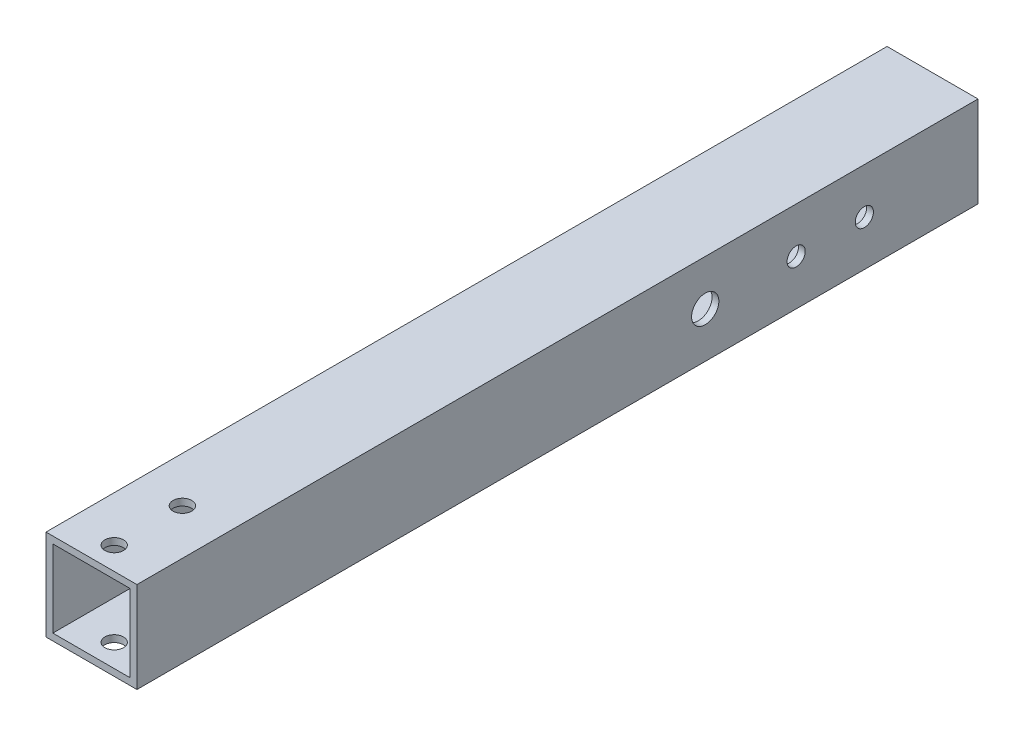
ISO-10303-21;
HEADER;
FILE_DESCRIPTION(('STEP AP214'),'2;1');
FILE_NAME('part.step','',(''),(''),'','','');
FILE_SCHEMA(('AUTOMOTIVE_DESIGN { 1 0 10303 214 1 1 1 1 }'));
ENDSEC;
DATA;
#1=APPLICATION_CONTEXT('core data for automotive mechanical design processes');
#2=APPLICATION_PROTOCOL_DEFINITION('international standard','automotive_design',2000,#1);
#3=PRODUCT_CONTEXT('',#1,'mechanical');
#4=PRODUCT('Part','Part','',(#3));
#5=PRODUCT_RELATED_PRODUCT_CATEGORY('part','',(#4));
#6=PRODUCT_DEFINITION_FORMATION('','',#4);
#7=PRODUCT_DEFINITION_CONTEXT('part definition',#1,'design');
#8=PRODUCT_DEFINITION('design','',#6,#7);
#9=PRODUCT_DEFINITION_SHAPE('','',#8);
#10=(LENGTH_UNIT() NAMED_UNIT(*) SI_UNIT(.MILLI.,.METRE.));
#11=(NAMED_UNIT(*) PLANE_ANGLE_UNIT() SI_UNIT($,.RADIAN.));
#12=(NAMED_UNIT(*) SI_UNIT($,.STERADIAN.) SOLID_ANGLE_UNIT());
#13=UNCERTAINTY_MEASURE_WITH_UNIT(LENGTH_MEASURE(1.E-05),#10,'distance_accuracy_value','');
#14=(GEOMETRIC_REPRESENTATION_CONTEXT(3) GLOBAL_UNCERTAINTY_ASSIGNED_CONTEXT((#13)) GLOBAL_UNIT_ASSIGNED_CONTEXT((#10,
#11,#12)) REPRESENTATION_CONTEXT('',''));
#15=CARTESIAN_POINT('',(0.,0.,0.));
#16=DIRECTION('',(0.,0.,1.));
#17=DIRECTION('',(1.,0.,0.));
#18=AXIS2_PLACEMENT_3D('',#15,#16,#17);
#19=CARTESIAN_POINT('',(0.,0.,185.));
#20=DIRECTION('',(0.,0.,1.));
#21=DIRECTION('',(1.,0.,0.));
#22=AXIS2_PLACEMENT_3D('',#19,#20,#21);
#23=PLANE('',#22);
#24=DIRECTION('',(0.,1.,0.));
#25=VECTOR('',#24,1.);
#26=CARTESIAN_POINT('',(10.,10.,185.));
#27=LINE('',#26,#25);
#28=CARTESIAN_POINT('',(10.,-10.,185.));
#29=VERTEX_POINT('',#28);
#30=CARTESIAN_POINT('',(10.,10.,185.));
#31=VERTEX_POINT('',#30);
#32=EDGE_CURVE('E138',#29,#31,#27,.T.);
#33=ORIENTED_EDGE('',*,*,#32,.T.);
#34=DIRECTION('',(-1.,0.,0.));
#35=VECTOR('',#34,1.);
#36=CARTESIAN_POINT('',(-10.,10.,185.));
#37=LINE('',#36,#35);
#38=CARTESIAN_POINT('',(-10.,10.,185.));
#39=VERTEX_POINT('',#38);
#40=EDGE_CURVE('E141',#31,#39,#37,.T.);
#41=ORIENTED_EDGE('',*,*,#40,.T.);
#42=DIRECTION('',(0.,-1.,0.));
#43=VECTOR('',#42,1.);
#44=CARTESIAN_POINT('',(-10.,10.,185.));
#45=LINE('',#44,#43);
#46=CARTESIAN_POINT('',(-10.,-10.,185.));
#47=VERTEX_POINT('',#46);
#48=EDGE_CURVE('E144',#39,#47,#45,.T.);
#49=ORIENTED_EDGE('',*,*,#48,.T.);
#50=DIRECTION('',(1.,0.,0.));
#51=VECTOR('',#50,1.);
#52=CARTESIAN_POINT('',(-10.,-10.,185.));
#53=LINE('',#52,#51);
#54=EDGE_CURVE('E146',#47,#29,#53,.T.);
#55=ORIENTED_EDGE('',*,*,#54,.T.);
#56=EDGE_LOOP('',(#33,#41,#49,#55));
#57=FACE_BOUND('',#56,.T.);
#58=DIRECTION('',(-1.,0.,0.));
#59=VECTOR('',#58,1.);
#60=CARTESIAN_POINT('',(-8.5,8.5,185.));
#61=LINE('',#60,#59);
#62=CARTESIAN_POINT('',(8.5,8.5,185.));
#63=VERTEX_POINT('',#62);
#64=CARTESIAN_POINT('',(-8.5,8.5,185.));
#65=VERTEX_POINT('',#64);
#66=EDGE_CURVE('E108',#63,#65,#61,.T.);
#67=ORIENTED_EDGE('',*,*,#66,.F.);
#68=DIRECTION('',(0.,1.,0.));
#69=VECTOR('',#68,1.);
#70=CARTESIAN_POINT('',(8.5,8.5,185.));
#71=LINE('',#70,#69);
#72=CARTESIAN_POINT('',(8.5,-8.5,185.));
#73=VERTEX_POINT('',#72);
#74=EDGE_CURVE('E100',#73,#63,#71,.T.);
#75=ORIENTED_EDGE('',*,*,#74,.F.);
#76=DIRECTION('',(1.,0.,0.));
#77=VECTOR('',#76,1.);
#78=CARTESIAN_POINT('',(-8.5,-8.5,185.));
#79=LINE('',#78,#77);
#80=CARTESIAN_POINT('',(-8.5,-8.5,185.));
#81=VERTEX_POINT('',#80);
#82=EDGE_CURVE('E122',#81,#73,#79,.T.);
#83=ORIENTED_EDGE('',*,*,#82,.F.);
#84=DIRECTION('',(0.,-1.,0.));
#85=VECTOR('',#84,1.);
#86=CARTESIAN_POINT('',(-8.5,8.5,185.));
#87=LINE('',#86,#85);
#88=EDGE_CURVE('E120',#65,#81,#87,.T.);
#89=ORIENTED_EDGE('',*,*,#88,.F.);
#90=EDGE_LOOP('',(#67,#75,#83,#89));
#91=FACE_BOUND('',#90,.T.);
#92=ADVANCED_FACE('F33',(#57,#91),#23,.T.);
#93=CARTESIAN_POINT('',(0.,0.,0.));
#94=DIRECTION('',(0.,0.,1.));
#95=DIRECTION('',(1.,0.,0.));
#96=AXIS2_PLACEMENT_3D('',#93,#94,#95);
#97=PLANE('',#96);
#98=DIRECTION('',(0.,1.,0.));
#99=VECTOR('',#98,1.);
#100=CARTESIAN_POINT('',(10.,10.,0.));
#101=LINE('',#100,#99);
#102=CARTESIAN_POINT('',(10.,-10.,0.));
#103=VERTEX_POINT('',#102);
#104=CARTESIAN_POINT('',(10.,10.,0.));
#105=VERTEX_POINT('',#104);
#106=EDGE_CURVE('E116',#103,#105,#101,.T.);
#107=ORIENTED_EDGE('',*,*,#106,.F.);
#108=DIRECTION('',(1.,0.,0.));
#109=VECTOR('',#108,1.);
#110=CARTESIAN_POINT('',(-10.,-10.,0.));
#111=LINE('',#110,#109);
#112=CARTESIAN_POINT('',(-10.,-10.,0.));
#113=VERTEX_POINT('',#112);
#114=EDGE_CURVE('E142',#113,#103,#111,.T.);
#115=ORIENTED_EDGE('',*,*,#114,.F.);
#116=DIRECTION('',(0.,-1.,0.));
#117=VECTOR('',#116,1.);
#118=CARTESIAN_POINT('',(-10.,10.,0.));
#119=LINE('',#118,#117);
#120=CARTESIAN_POINT('',(-10.,10.,0.));
#121=VERTEX_POINT('',#120);
#122=EDGE_CURVE('E153',#121,#113,#119,.T.);
#123=ORIENTED_EDGE('',*,*,#122,.F.);
#124=DIRECTION('',(-1.,0.,0.));
#125=VECTOR('',#124,1.);
#126=CARTESIAN_POINT('',(-10.,10.,0.));
#127=LINE('',#126,#125);
#128=EDGE_CURVE('E151',#105,#121,#127,.T.);
#129=ORIENTED_EDGE('',*,*,#128,.F.);
#130=EDGE_LOOP('',(#107,#115,#123,#129));
#131=FACE_BOUND('',#130,.T.);
#132=DIRECTION('',(0.,1.,0.));
#133=VECTOR('',#132,1.);
#134=CARTESIAN_POINT('',(8.5,8.5,0.));
#135=LINE('',#134,#133);
#136=CARTESIAN_POINT('',(8.5,-8.5,0.));
#137=VERTEX_POINT('',#136);
#138=CARTESIAN_POINT('',(8.5,8.5,0.));
#139=VERTEX_POINT('',#138);
#140=EDGE_CURVE('E58',#137,#139,#135,.T.);
#141=ORIENTED_EDGE('',*,*,#140,.T.);
#142=DIRECTION('',(-1.,0.,0.));
#143=VECTOR('',#142,1.);
#144=CARTESIAN_POINT('',(-8.5,8.5,0.));
#145=LINE('',#144,#143);
#146=CARTESIAN_POINT('',(-8.5,8.5,0.));
#147=VERTEX_POINT('',#146);
#148=EDGE_CURVE('E115',#139,#147,#145,.T.);
#149=ORIENTED_EDGE('',*,*,#148,.T.);
#150=DIRECTION('',(0.,-1.,0.));
#151=VECTOR('',#150,1.);
#152=CARTESIAN_POINT('',(-8.5,8.5,0.));
#153=LINE('',#152,#151);
#154=CARTESIAN_POINT('',(-8.5,-8.5,0.));
#155=VERTEX_POINT('',#154);
#156=EDGE_CURVE('E130',#147,#155,#153,.T.);
#157=ORIENTED_EDGE('',*,*,#156,.T.);
#158=DIRECTION('',(1.,0.,0.));
#159=VECTOR('',#158,1.);
#160=CARTESIAN_POINT('',(-8.5,-8.5,0.));
#161=LINE('',#160,#159);
#162=EDGE_CURVE('E109',#155,#137,#161,.T.);
#163=ORIENTED_EDGE('',*,*,#162,.T.);
#164=EDGE_LOOP('',(#141,#149,#157,#163));
#165=FACE_BOUND('',#164,.T.);
#166=ADVANCED_FACE('F235',(#131,#165),#97,.F.);
#167=CARTESIAN_POINT('',(10.,10.,185.));
#168=DIRECTION('',(-1.,0.,0.));
#169=DIRECTION('',(0.,0.,1.));
#170=AXIS2_PLACEMENT_3D('',#167,#168,#169);
#171=PLANE('',#170);
#172=CARTESIAN_POINT('',(10.,0.,60.));
#173=DIRECTION('',(-1.,0.,0.));
#174=DIRECTION('',(0.,0.,1.));
#175=AXIS2_PLACEMENT_3D('',#172,#173,#174);
#176=CIRCLE('',#175,3.00000000000001);
#177=CARTESIAN_POINT('',(10.,0.,63.));
#178=VERTEX_POINT('',#177);
#179=EDGE_CURVE('E318',#178,#178,#176,.T.);
#180=ORIENTED_EDGE('',*,*,#179,.T.);
#181=EDGE_LOOP('',(#180));
#182=FACE_BOUND('',#181,.T.);
#183=CARTESIAN_POINT('',(10.,0.,40.));
#184=DIRECTION('',(1.,0.,0.));
#185=DIRECTION('',(0.,1.,0.));
#186=AXIS2_PLACEMENT_3D('',#183,#184,#185);
#187=CIRCLE('',#186,2.);
#188=CARTESIAN_POINT('',(10.,2.,40.));
#189=VERTEX_POINT('',#188);
#190=EDGE_CURVE('E186',#189,#189,#187,.T.);
#191=ORIENTED_EDGE('',*,*,#190,.F.);
#192=EDGE_LOOP('',(#191));
#193=FACE_BOUND('',#192,.T.);
#194=CARTESIAN_POINT('',(10.,0.,25.));
#195=DIRECTION('',(1.,0.,0.));
#196=DIRECTION('',(0.,1.,0.));
#197=AXIS2_PLACEMENT_3D('',#194,#195,#196);
#198=CIRCLE('',#197,2.);
#199=CARTESIAN_POINT('',(10.,2.,25.));
#200=VERTEX_POINT('',#199);
#201=EDGE_CURVE('E183',#200,#200,#198,.T.);
#202=ORIENTED_EDGE('',*,*,#201,.F.);
#203=EDGE_LOOP('',(#202));
#204=FACE_BOUND('',#203,.T.);
#205=ORIENTED_EDGE('',*,*,#106,.T.);
#206=DIRECTION('',(0.,0.,-1.));
#207=VECTOR('',#206,1.);
#208=CARTESIAN_POINT('',(10.,10.,185.));
#209=LINE('',#208,#207);
#210=EDGE_CURVE('E11',#31,#105,#209,.T.);
#211=ORIENTED_EDGE('',*,*,#210,.F.);
#212=ORIENTED_EDGE('',*,*,#32,.F.);
#213=DIRECTION('',(0.,0.,-1.));
#214=VECTOR('',#213,1.);
#215=CARTESIAN_POINT('',(10.,-10.,185.));
#216=LINE('',#215,#214);
#217=EDGE_CURVE('E148',#29,#103,#216,.T.);
#218=ORIENTED_EDGE('',*,*,#217,.T.);
#219=EDGE_LOOP('',(#205,#211,#212,#218));
#220=FACE_BOUND('',#219,.T.);
#221=ADVANCED_FACE('F35',(#182,#193,#204,#220),#171,.F.);
#222=CARTESIAN_POINT('',(-10.,10.,185.));
#223=DIRECTION('',(0.,-1.,0.));
#224=DIRECTION('',(1.,0.,0.));
#225=AXIS2_PLACEMENT_3D('',#222,#223,#224);
#226=PLANE('',#225);
#227=CARTESIAN_POINT('',(0.,10.,165.));
#228=DIRECTION('',(0.,1.,0.));
#229=DIRECTION('',(0.,0.,1.));
#230=AXIS2_PLACEMENT_3D('',#227,#228,#229);
#231=CIRCLE('',#230,2.05);
#232=CARTESIAN_POINT('',(0.,10.,167.05));
#233=VERTEX_POINT('',#232);
#234=EDGE_CURVE('E202',#233,#233,#231,.T.);
#235=ORIENTED_EDGE('',*,*,#234,.F.);
#236=EDGE_LOOP('',(#235));
#237=FACE_BOUND('',#236,.T.);
#238=CARTESIAN_POINT('',(0.,10.,180.));
#239=DIRECTION('',(0.,1.,0.));
#240=DIRECTION('',(0.,0.,1.));
#241=AXIS2_PLACEMENT_3D('',#238,#239,#240);
#242=CIRCLE('',#241,2.05);
#243=CARTESIAN_POINT('',(0.,10.,182.05));
#244=VERTEX_POINT('',#243);
#245=EDGE_CURVE('E209',#244,#244,#242,.T.);
#246=ORIENTED_EDGE('',*,*,#245,.F.);
#247=EDGE_LOOP('',(#246));
#248=FACE_BOUND('',#247,.T.);
#249=ORIENTED_EDGE('',*,*,#128,.T.);
#250=DIRECTION('',(0.,0.,-1.));
#251=VECTOR('',#250,1.);
#252=CARTESIAN_POINT('',(-10.,10.,185.));
#253=LINE('',#252,#251);
#254=EDGE_CURVE('E42',#39,#121,#253,.T.);
#255=ORIENTED_EDGE('',*,*,#254,.F.);
#256=ORIENTED_EDGE('',*,*,#40,.F.);
#257=ORIENTED_EDGE('',*,*,#210,.T.);
#258=EDGE_LOOP('',(#249,#255,#256,#257));
#259=FACE_BOUND('',#258,.T.);
#260=ADVANCED_FACE('F249',(#237,#248,#259),#226,.F.);
#261=CARTESIAN_POINT('',(-10.,10.,185.));
#262=DIRECTION('',(1.,0.,0.));
#263=DIRECTION('',(0.,0.,-1.));
#264=AXIS2_PLACEMENT_3D('',#261,#262,#263);
#265=PLANE('',#264);
#266=CARTESIAN_POINT('',(-10.,0.,60.));
#267=DIRECTION('',(-1.,0.,0.));
#268=DIRECTION('',(0.,0.,1.));
#269=AXIS2_PLACEMENT_3D('',#266,#267,#268);
#270=CIRCLE('',#269,3.00000000000001);
#271=CARTESIAN_POINT('',(-10.,0.,63.));
#272=VERTEX_POINT('',#271);
#273=EDGE_CURVE('E317',#272,#272,#270,.T.);
#274=ORIENTED_EDGE('',*,*,#273,.F.);
#275=EDGE_LOOP('',(#274));
#276=FACE_BOUND('',#275,.T.);
#277=CARTESIAN_POINT('',(-10.,0.,40.));
#278=DIRECTION('',(1.,0.,0.));
#279=DIRECTION('',(0.,1.,0.));
#280=AXIS2_PLACEMENT_3D('',#277,#278,#279);
#281=CIRCLE('',#280,2.);
#282=CARTESIAN_POINT('',(-10.,2.,40.));
#283=VERTEX_POINT('',#282);
#284=EDGE_CURVE('E179',#283,#283,#281,.T.);
#285=ORIENTED_EDGE('',*,*,#284,.T.);
#286=EDGE_LOOP('',(#285));
#287=FACE_BOUND('',#286,.T.);
#288=CARTESIAN_POINT('',(-10.,0.,25.));
#289=DIRECTION('',(1.,0.,0.));
#290=DIRECTION('',(0.,1.,0.));
#291=AXIS2_PLACEMENT_3D('',#288,#289,#290);
#292=CIRCLE('',#291,2.);
#293=CARTESIAN_POINT('',(-10.,2.,25.));
#294=VERTEX_POINT('',#293);
#295=EDGE_CURVE('E175',#294,#294,#292,.T.);
#296=ORIENTED_EDGE('',*,*,#295,.T.);
#297=EDGE_LOOP('',(#296));
#298=FACE_BOUND('',#297,.T.);
#299=ORIENTED_EDGE('',*,*,#122,.T.);
#300=DIRECTION('',(0.,0.,-1.));
#301=VECTOR('',#300,1.);
#302=CARTESIAN_POINT('',(-10.,-10.,185.));
#303=LINE('',#302,#301);
#304=EDGE_CURVE('E158',#47,#113,#303,.T.);
#305=ORIENTED_EDGE('',*,*,#304,.F.);
#306=ORIENTED_EDGE('',*,*,#48,.F.);
#307=ORIENTED_EDGE('',*,*,#254,.T.);
#308=EDGE_LOOP('',(#299,#305,#306,#307));
#309=FACE_BOUND('',#308,.T.);
#310=ADVANCED_FACE('F246',(#276,#287,#298,#309),#265,.F.);
#311=CARTESIAN_POINT('',(-10.,-10.,185.));
#312=DIRECTION('',(0.,1.,0.));
#313=DIRECTION('',(0.,0.,1.));
#314=AXIS2_PLACEMENT_3D('',#311,#312,#313);
#315=PLANE('',#314);
#316=CARTESIAN_POINT('',(0.,-10.,165.));
#317=DIRECTION('',(0.,1.,0.));
#318=DIRECTION('',(0.,0.,1.));
#319=AXIS2_PLACEMENT_3D('',#316,#317,#318);
#320=CIRCLE('',#319,2.05);
#321=CARTESIAN_POINT('',(0.,-10.,167.05));
#322=VERTEX_POINT('',#321);
#323=EDGE_CURVE('E171',#322,#322,#320,.T.);
#324=ORIENTED_EDGE('',*,*,#323,.T.);
#325=EDGE_LOOP('',(#324));
#326=FACE_BOUND('',#325,.T.);
#327=CARTESIAN_POINT('',(0.,-10.,180.));
#328=DIRECTION('',(0.,1.,0.));
#329=DIRECTION('',(0.,0.,1.));
#330=AXIS2_PLACEMENT_3D('',#327,#328,#329);
#331=CIRCLE('',#330,2.05);
#332=CARTESIAN_POINT('',(0.,-10.,182.05));
#333=VERTEX_POINT('',#332);
#334=EDGE_CURVE('E166',#333,#333,#331,.T.);
#335=ORIENTED_EDGE('',*,*,#334,.T.);
#336=EDGE_LOOP('',(#335));
#337=FACE_BOUND('',#336,.T.);
#338=ORIENTED_EDGE('',*,*,#114,.T.);
#339=ORIENTED_EDGE('',*,*,#217,.F.);
#340=ORIENTED_EDGE('',*,*,#54,.F.);
#341=ORIENTED_EDGE('',*,*,#304,.T.);
#342=EDGE_LOOP('',(#338,#339,#340,#341));
#343=FACE_BOUND('',#342,.T.);
#344=ADVANCED_FACE('F230',(#326,#337,#343),#315,.F.);
#345=CARTESIAN_POINT('',(8.5,8.5,185.));
#346=DIRECTION('',(-1.,0.,0.));
#347=DIRECTION('',(0.,0.,1.));
#348=AXIS2_PLACEMENT_3D('',#345,#346,#347);
#349=PLANE('',#348);
#350=CARTESIAN_POINT('',(8.5,0.,60.));
#351=DIRECTION('',(-1.,0.,0.));
#352=DIRECTION('',(0.,0.,1.));
#353=AXIS2_PLACEMENT_3D('',#350,#351,#352);
#354=CIRCLE('',#353,3.00000000000001);
#355=CARTESIAN_POINT('',(8.5,0.,63.));
#356=VERTEX_POINT('',#355);
#357=EDGE_CURVE('E191',#356,#356,#354,.T.);
#358=ORIENTED_EDGE('',*,*,#357,.F.);
#359=EDGE_LOOP('',(#358));
#360=FACE_BOUND('',#359,.T.);
#361=CARTESIAN_POINT('',(8.5,0.,40.));
#362=DIRECTION('',(-1.,0.,0.));
#363=DIRECTION('',(0.,0.,1.));
#364=AXIS2_PLACEMENT_3D('',#361,#362,#363);
#365=CIRCLE('',#364,2.);
#366=CARTESIAN_POINT('',(8.5,0.,42.));
#367=VERTEX_POINT('',#366);
#368=EDGE_CURVE('E178',#367,#367,#365,.T.);
#369=ORIENTED_EDGE('',*,*,#368,.F.);
#370=EDGE_LOOP('',(#369));
#371=FACE_BOUND('',#370,.T.);
#372=CARTESIAN_POINT('',(8.5,0.,25.));
#373=DIRECTION('',(-1.,0.,0.));
#374=DIRECTION('',(0.,0.,1.));
#375=AXIS2_PLACEMENT_3D('',#372,#373,#374);
#376=CIRCLE('',#375,2.);
#377=CARTESIAN_POINT('',(8.5,0.,27.));
#378=VERTEX_POINT('',#377);
#379=EDGE_CURVE('E174',#378,#378,#376,.T.);
#380=ORIENTED_EDGE('',*,*,#379,.F.);
#381=EDGE_LOOP('',(#380));
#382=FACE_BOUND('',#381,.T.);
#383=ORIENTED_EDGE('',*,*,#140,.F.);
#384=DIRECTION('',(0.,0.,-1.));
#385=VECTOR('',#384,1.);
#386=CARTESIAN_POINT('',(8.5,-8.5,185.));
#387=LINE('',#386,#385);
#388=EDGE_CURVE('E104',#73,#137,#387,.T.);
#389=ORIENTED_EDGE('',*,*,#388,.F.);
#390=ORIENTED_EDGE('',*,*,#74,.T.);
#391=DIRECTION('',(0.,0.,-1.));
#392=VECTOR('',#391,1.);
#393=CARTESIAN_POINT('',(8.5,8.5,185.));
#394=LINE('',#393,#392);
#395=EDGE_CURVE('E103',#63,#139,#394,.T.);
#396=ORIENTED_EDGE('',*,*,#395,.T.);
#397=EDGE_LOOP('',(#383,#389,#390,#396));
#398=FACE_BOUND('',#397,.T.);
#399=ADVANCED_FACE('F102',(#360,#371,#382,#398),#349,.T.);
#400=CARTESIAN_POINT('',(-8.5,8.5,185.));
#401=DIRECTION('',(0.,-1.,0.));
#402=DIRECTION('',(1.,0.,0.));
#403=AXIS2_PLACEMENT_3D('',#400,#401,#402);
#404=PLANE('',#403);
#405=CARTESIAN_POINT('',(0.,8.5,165.));
#406=DIRECTION('',(0.,-1.,0.));
#407=DIRECTION('',(1.,0.,0.));
#408=AXIS2_PLACEMENT_3D('',#405,#406,#407);
#409=CIRCLE('',#408,2.05);
#410=CARTESIAN_POINT('',(2.05,8.5,165.));
#411=VERTEX_POINT('',#410);
#412=EDGE_CURVE('E170',#411,#411,#409,.T.);
#413=ORIENTED_EDGE('',*,*,#412,.F.);
#414=EDGE_LOOP('',(#413));
#415=FACE_BOUND('',#414,.T.);
#416=CARTESIAN_POINT('',(0.,8.5,180.));
#417=DIRECTION('',(0.,-1.,0.));
#418=DIRECTION('',(1.,0.,0.));
#419=AXIS2_PLACEMENT_3D('',#416,#417,#418);
#420=CIRCLE('',#419,2.05);
#421=CARTESIAN_POINT('',(2.05000000000001,8.5,180.));
#422=VERTEX_POINT('',#421);
#423=EDGE_CURVE('E128',#422,#422,#420,.T.);
#424=ORIENTED_EDGE('',*,*,#423,.F.);
#425=EDGE_LOOP('',(#424));
#426=FACE_BOUND('',#425,.T.);
#427=ORIENTED_EDGE('',*,*,#148,.F.);
#428=ORIENTED_EDGE('',*,*,#395,.F.);
#429=ORIENTED_EDGE('',*,*,#66,.T.);
#430=DIRECTION('',(0.,0.,-1.));
#431=VECTOR('',#430,1.);
#432=CARTESIAN_POINT('',(-8.5,8.5,185.));
#433=LINE('',#432,#431);
#434=EDGE_CURVE('E117',#65,#147,#433,.T.);
#435=ORIENTED_EDGE('',*,*,#434,.T.);
#436=EDGE_LOOP('',(#427,#428,#429,#435));
#437=FACE_BOUND('',#436,.T.);
#438=ADVANCED_FACE('F112',(#415,#426,#437),#404,.T.);
#439=CARTESIAN_POINT('',(-8.5,8.5,185.));
#440=DIRECTION('',(1.,0.,0.));
#441=DIRECTION('',(0.,1.,0.));
#442=AXIS2_PLACEMENT_3D('',#439,#440,#441);
#443=PLANE('',#442);
#444=CARTESIAN_POINT('',(-8.5,0.,60.));
#445=DIRECTION('',(1.,0.,0.));
#446=DIRECTION('',(0.,1.,0.));
#447=AXIS2_PLACEMENT_3D('',#444,#445,#446);
#448=CIRCLE('',#447,3.00000000000001);
#449=CARTESIAN_POINT('',(-8.5,3.00000000000001,60.));
#450=VERTEX_POINT('',#449);
#451=EDGE_CURVE('E37',#450,#450,#448,.T.);
#452=ORIENTED_EDGE('',*,*,#451,.F.);
#453=EDGE_LOOP('',(#452));
#454=FACE_BOUND('',#453,.T.);
#455=CARTESIAN_POINT('',(-8.5,0.,40.));
#456=DIRECTION('',(1.,0.,0.));
#457=DIRECTION('',(0.,1.,0.));
#458=AXIS2_PLACEMENT_3D('',#455,#456,#457);
#459=CIRCLE('',#458,2.);
#460=CARTESIAN_POINT('',(-8.5,2.,40.));
#461=VERTEX_POINT('',#460);
#462=EDGE_CURVE('E176',#461,#461,#459,.T.);
#463=ORIENTED_EDGE('',*,*,#462,.F.);
#464=EDGE_LOOP('',(#463));
#465=FACE_BOUND('',#464,.T.);
#466=CARTESIAN_POINT('',(-8.5,0.,25.));
#467=DIRECTION('',(1.,0.,0.));
#468=DIRECTION('',(0.,1.,0.));
#469=AXIS2_PLACEMENT_3D('',#466,#467,#468);
#470=CIRCLE('',#469,2.);
#471=CARTESIAN_POINT('',(-8.5,2.,25.));
#472=VERTEX_POINT('',#471);
#473=EDGE_CURVE('E172',#472,#472,#470,.T.);
#474=ORIENTED_EDGE('',*,*,#473,.F.);
#475=EDGE_LOOP('',(#474));
#476=FACE_BOUND('',#475,.T.);
#477=ORIENTED_EDGE('',*,*,#156,.F.);
#478=ORIENTED_EDGE('',*,*,#434,.F.);
#479=ORIENTED_EDGE('',*,*,#88,.T.);
#480=DIRECTION('',(0.,0.,-1.));
#481=VECTOR('',#480,1.);
#482=CARTESIAN_POINT('',(-8.5,-8.5,185.));
#483=LINE('',#482,#481);
#484=EDGE_CURVE('E50',#81,#155,#483,.T.);
#485=ORIENTED_EDGE('',*,*,#484,.T.);
#486=EDGE_LOOP('',(#477,#478,#479,#485));
#487=FACE_BOUND('',#486,.T.);
#488=ADVANCED_FACE('F220',(#454,#465,#476,#487),#443,.T.);
#489=CARTESIAN_POINT('',(-8.5,-8.5,185.));
#490=DIRECTION('',(0.,1.,0.));
#491=DIRECTION('',(0.,0.,1.));
#492=AXIS2_PLACEMENT_3D('',#489,#490,#491);
#493=PLANE('',#492);
#494=CARTESIAN_POINT('',(0.,-8.5,165.));
#495=DIRECTION('',(0.,1.,0.));
#496=DIRECTION('',(0.,0.,1.));
#497=AXIS2_PLACEMENT_3D('',#494,#495,#496);
#498=CIRCLE('',#497,2.05);
#499=CARTESIAN_POINT('',(0.,-8.5,167.05));
#500=VERTEX_POINT('',#499);
#501=EDGE_CURVE('E167',#500,#500,#498,.T.);
#502=ORIENTED_EDGE('',*,*,#501,.F.);
#503=EDGE_LOOP('',(#502));
#504=FACE_BOUND('',#503,.T.);
#505=CARTESIAN_POINT('',(0.,-8.5,180.));
#506=DIRECTION('',(0.,1.,0.));
#507=DIRECTION('',(0.,0.,1.));
#508=AXIS2_PLACEMENT_3D('',#505,#506,#507);
#509=CIRCLE('',#508,2.05);
#510=CARTESIAN_POINT('',(0.,-8.5,182.05));
#511=VERTEX_POINT('',#510);
#512=EDGE_CURVE('E163',#511,#511,#509,.T.);
#513=ORIENTED_EDGE('',*,*,#512,.F.);
#514=EDGE_LOOP('',(#513));
#515=FACE_BOUND('',#514,.T.);
#516=ORIENTED_EDGE('',*,*,#162,.F.);
#517=ORIENTED_EDGE('',*,*,#484,.F.);
#518=ORIENTED_EDGE('',*,*,#82,.T.);
#519=ORIENTED_EDGE('',*,*,#388,.T.);
#520=EDGE_LOOP('',(#516,#517,#518,#519));
#521=FACE_BOUND('',#520,.T.);
#522=ADVANCED_FACE('F227',(#504,#515,#521),#493,.T.);
#523=CARTESIAN_POINT('',(0.,-10.,180.));
#524=DIRECTION('',(0.,1.,0.));
#525=DIRECTION('',(0.,0.,1.));
#526=AXIS2_PLACEMENT_3D('',#523,#524,#525);
#527=CYLINDRICAL_SURFACE('',#526,2.05);
#528=ORIENTED_EDGE('',*,*,#512,.T.);
#529=EDGE_LOOP('',(#528));
#530=FACE_BOUND('',#529,.T.);
#531=ORIENTED_EDGE('',*,*,#334,.F.);
#532=EDGE_LOOP('',(#531));
#533=FACE_BOUND('',#532,.T.);
#534=ADVANCED_FACE('F277',(#530,#533),#527,.F.);
#535=ORIENTED_EDGE('',*,*,#423,.T.);
#536=EDGE_LOOP('',(#535));
#537=FACE_BOUND('',#536,.T.);
#538=ORIENTED_EDGE('',*,*,#245,.T.);
#539=EDGE_LOOP('',(#538));
#540=FACE_BOUND('',#539,.T.);
#541=ADVANCED_FACE('F216',(#537,#540),#527,.F.);
#542=CARTESIAN_POINT('',(0.,-10.,165.));
#543=DIRECTION('',(0.,1.,0.));
#544=DIRECTION('',(0.,0.,1.));
#545=AXIS2_PLACEMENT_3D('',#542,#543,#544);
#546=CYLINDRICAL_SURFACE('',#545,2.05);
#547=ORIENTED_EDGE('',*,*,#501,.T.);
#548=EDGE_LOOP('',(#547));
#549=FACE_BOUND('',#548,.T.);
#550=ORIENTED_EDGE('',*,*,#323,.F.);
#551=EDGE_LOOP('',(#550));
#552=FACE_BOUND('',#551,.T.);
#553=ADVANCED_FACE('F288',(#549,#552),#546,.F.);
#554=ORIENTED_EDGE('',*,*,#412,.T.);
#555=EDGE_LOOP('',(#554));
#556=FACE_BOUND('',#555,.T.);
#557=ORIENTED_EDGE('',*,*,#234,.T.);
#558=EDGE_LOOP('',(#557));
#559=FACE_BOUND('',#558,.T.);
#560=ADVANCED_FACE('F291',(#556,#559),#546,.F.);
#561=CARTESIAN_POINT('',(-10.,0.,25.));
#562=DIRECTION('',(1.,0.,0.));
#563=DIRECTION('',(0.,1.,0.));
#564=AXIS2_PLACEMENT_3D('',#561,#562,#563);
#565=CYLINDRICAL_SURFACE('',#564,2.);
#566=ORIENTED_EDGE('',*,*,#473,.T.);
#567=EDGE_LOOP('',(#566));
#568=FACE_BOUND('',#567,.T.);
#569=ORIENTED_EDGE('',*,*,#295,.F.);
#570=EDGE_LOOP('',(#569));
#571=FACE_BOUND('',#570,.T.);
#572=ADVANCED_FACE('F293',(#568,#571),#565,.F.);
#573=ORIENTED_EDGE('',*,*,#379,.T.);
#574=EDGE_LOOP('',(#573));
#575=FACE_BOUND('',#574,.T.);
#576=ORIENTED_EDGE('',*,*,#201,.T.);
#577=EDGE_LOOP('',(#576));
#578=FACE_BOUND('',#577,.T.);
#579=ADVANCED_FACE('F296',(#575,#578),#565,.F.);
#580=CARTESIAN_POINT('',(-10.,0.,40.));
#581=DIRECTION('',(1.,0.,0.));
#582=DIRECTION('',(0.,1.,0.));
#583=AXIS2_PLACEMENT_3D('',#580,#581,#582);
#584=CYLINDRICAL_SURFACE('',#583,2.);
#585=ORIENTED_EDGE('',*,*,#462,.T.);
#586=EDGE_LOOP('',(#585));
#587=FACE_BOUND('',#586,.T.);
#588=ORIENTED_EDGE('',*,*,#284,.F.);
#589=EDGE_LOOP('',(#588));
#590=FACE_BOUND('',#589,.T.);
#591=ADVANCED_FACE('F298',(#587,#590),#584,.F.);
#592=ORIENTED_EDGE('',*,*,#368,.T.);
#593=EDGE_LOOP('',(#592));
#594=FACE_BOUND('',#593,.T.);
#595=ORIENTED_EDGE('',*,*,#190,.T.);
#596=EDGE_LOOP('',(#595));
#597=FACE_BOUND('',#596,.T.);
#598=ADVANCED_FACE('F301',(#594,#597),#584,.F.);
#599=CARTESIAN_POINT('',(10.,0.,60.));
#600=DIRECTION('',(-1.,0.,0.));
#601=DIRECTION('',(0.,0.,1.));
#602=AXIS2_PLACEMENT_3D('',#599,#600,#601);
#603=CYLINDRICAL_SURFACE('',#602,3.00000000000001);
#604=ORIENTED_EDGE('',*,*,#451,.T.);
#605=EDGE_LOOP('',(#604));
#606=FACE_BOUND('',#605,.T.);
#607=ORIENTED_EDGE('',*,*,#273,.T.);
#608=EDGE_LOOP('',(#607));
#609=FACE_BOUND('',#608,.T.);
#610=ADVANCED_FACE('F302',(#606,#609),#603,.F.);
#611=ORIENTED_EDGE('',*,*,#357,.T.);
#612=EDGE_LOOP('',(#611));
#613=FACE_BOUND('',#612,.T.);
#614=ORIENTED_EDGE('',*,*,#179,.F.);
#615=EDGE_LOOP('',(#614));
#616=FACE_BOUND('',#615,.T.);
#617=ADVANCED_FACE('F304',(#613,#616),#603,.F.);
#618=CLOSED_SHELL('',(#92,#166,#221,#260,#310,#344,#399,#438,#488,#522,#534,#541,#553,#560,#572,
#579,#591,#598,#610,#617));
#619=MANIFOLD_SOLID_BREP('B2',#618);
#620=ADVANCED_BREP_SHAPE_REPRESENTATION('',(#18,#619),#14);
#621=SHAPE_DEFINITION_REPRESENTATION(#9,#620);
ENDSEC;
END-ISO-10303-21;
